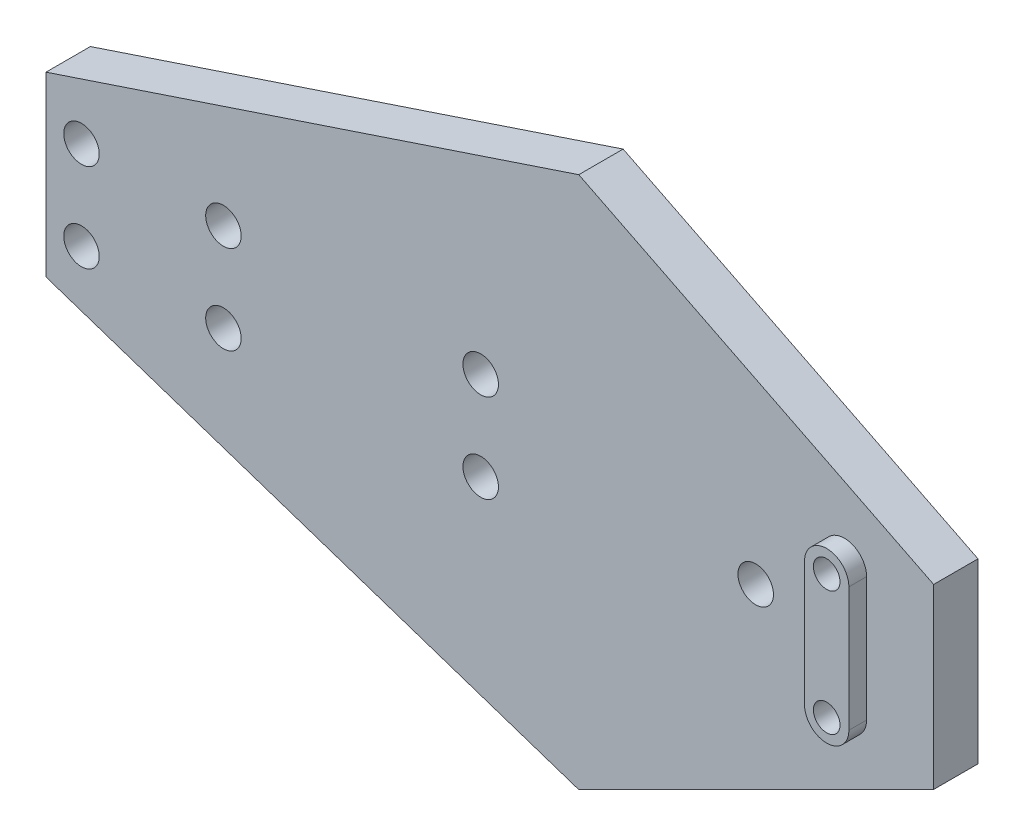
ISO-10303-21;
HEADER;
FILE_DESCRIPTION(('STEP AP214'),'2;1');
FILE_NAME('part.step','',(''),(''),'','','');
FILE_SCHEMA(('AUTOMOTIVE_DESIGN { 1 0 10303 214 1 1 1 1 }'));
ENDSEC;
DATA;
#1=APPLICATION_CONTEXT('core data for automotive mechanical design processes');
#2=APPLICATION_PROTOCOL_DEFINITION('international standard','automotive_design',2000,#1);
#3=PRODUCT_CONTEXT('',#1,'mechanical');
#4=PRODUCT('Part','Part','',(#3));
#5=PRODUCT_RELATED_PRODUCT_CATEGORY('part','',(#4));
#6=PRODUCT_DEFINITION_FORMATION('','',#4);
#7=PRODUCT_DEFINITION_CONTEXT('part definition',#1,'design');
#8=PRODUCT_DEFINITION('design','',#6,#7);
#9=PRODUCT_DEFINITION_SHAPE('','',#8);
#10=(LENGTH_UNIT() NAMED_UNIT(*) SI_UNIT(.MILLI.,.METRE.));
#11=(NAMED_UNIT(*) PLANE_ANGLE_UNIT() SI_UNIT($,.RADIAN.));
#12=(NAMED_UNIT(*) SI_UNIT($,.STERADIAN.) SOLID_ANGLE_UNIT());
#13=UNCERTAINTY_MEASURE_WITH_UNIT(LENGTH_MEASURE(1.E-05),#10,'distance_accuracy_value','');
#14=(GEOMETRIC_REPRESENTATION_CONTEXT(3) GLOBAL_UNCERTAINTY_ASSIGNED_CONTEXT((#13)) GLOBAL_UNIT_ASSIGNED_CONTEXT((#10,
#11,#12)) REPRESENTATION_CONTEXT('',''));
#15=CARTESIAN_POINT('',(0.,0.,0.));
#16=DIRECTION('',(0.,0.,1.));
#17=DIRECTION('',(1.,0.,0.));
#18=AXIS2_PLACEMENT_3D('',#15,#16,#17);
#19=CARTESIAN_POINT('',(0.,0.,2.5));
#20=DIRECTION('',(0.,0.,1.));
#21=DIRECTION('',(1.,0.,0.));
#22=AXIS2_PLACEMENT_3D('',#19,#20,#21);
#23=PLANE('',#22);
#24=CARTESIAN_POINT('',(49.,15.,2.5));
#25=DIRECTION('',(0.,0.,1.));
#26=DIRECTION('',(1.,0.,0.));
#27=AXIS2_PLACEMENT_3D('',#24,#25,#26);
#28=CIRCLE('',#27,2.);
#29=CARTESIAN_POINT('',(51.,15.,2.5));
#30=VERTEX_POINT('',#29);
#31=EDGE_CURVE('E204',#30,#30,#28,.T.);
#32=ORIENTED_EDGE('',*,*,#31,.F.);
#33=EDGE_LOOP('',(#32));
#34=FACE_BOUND('',#33,.T.);
#35=CARTESIAN_POINT('',(20.,15.,2.5));
#36=DIRECTION('',(0.,0.,1.));
#37=DIRECTION('',(1.,0.,0.));
#38=AXIS2_PLACEMENT_3D('',#35,#36,#37);
#39=CIRCLE('',#38,2.);
#40=CARTESIAN_POINT('',(22.,15.,2.5));
#41=VERTEX_POINT('',#40);
#42=EDGE_CURVE('E188',#41,#41,#39,.T.);
#43=ORIENTED_EDGE('',*,*,#42,.F.);
#44=EDGE_LOOP('',(#43));
#45=FACE_BOUND('',#44,.T.);
#46=DIRECTION('',(0.,-1.,0.));
#47=VECTOR('',#46,1.);
#48=CARTESIAN_POINT('',(0.,19.9970276153552,2.5));
#49=LINE('',#48,#47);
#50=CARTESIAN_POINT('',(0.,19.9970276153552,2.5));
#51=VERTEX_POINT('',#50);
#52=CARTESIAN_POINT('',(0.,0.,2.5));
#53=VERTEX_POINT('',#52);
#54=EDGE_CURVE('E159',#51,#53,#49,.T.);
#55=ORIENTED_EDGE('',*,*,#54,.T.);
#56=DIRECTION('',(0.948683298050514,-0.316227766016838,0.));
#57=VECTOR('',#56,1.);
#58=CARTESIAN_POINT('',(0.,0.,2.5));
#59=LINE('',#58,#57);
#60=CARTESIAN_POINT('',(60.0337040391287,-20.0112346797096,2.5));
#61=VERTEX_POINT('',#60);
#62=EDGE_CURVE('E99',#53,#61,#59,.T.);
#63=ORIENTED_EDGE('',*,*,#62,.T.);
#64=DIRECTION('',(0.894427190999916,0.447213595499958,0.));
#65=VECTOR('',#64,1.);
#66=CARTESIAN_POINT('',(60.0337040391287,-20.0112346797096,2.5));
#67=LINE('',#66,#65);
#68=CARTESIAN_POINT('',(100.056173398548,0.,2.5));
#69=VERTEX_POINT('',#68);
#70=EDGE_CURVE('E116',#61,#69,#67,.T.);
#71=ORIENTED_EDGE('',*,*,#70,.T.);
#72=DIRECTION('',(0.,1.,0.));
#73=VECTOR('',#72,1.);
#74=CARTESIAN_POINT('',(100.056173398548,0.,2.5));
#75=LINE('',#74,#73);
#76=CARTESIAN_POINT('',(100.056173398548,20.0157520815378,2.5));
#77=VERTEX_POINT('',#76);
#78=EDGE_CURVE('E109',#69,#77,#75,.T.);
#79=ORIENTED_EDGE('',*,*,#78,.T.);
#80=DIRECTION('',(-0.894427190999916,0.447213595499958,0.));
#81=VECTOR('',#80,1.);
#82=CARTESIAN_POINT('',(100.056173398548,20.0157520815378,2.5));
#83=LINE('',#82,#81);
#84=CARTESIAN_POINT('',(60.0561733985478,40.0157520815378,2.5));
#85=VERTEX_POINT('',#84);
#86=EDGE_CURVE('E113',#77,#85,#83,.T.);
#87=ORIENTED_EDGE('',*,*,#86,.T.);
#88=DIRECTION('',(-0.948683298050514,-0.316227766016838,0.));
#89=VECTOR('',#88,1.);
#90=CARTESIAN_POINT('',(60.0561733985478,40.0157520815378,2.5));
#91=LINE('',#90,#89);
#92=EDGE_CURVE('E64',#85,#51,#91,.T.);
#93=ORIENTED_EDGE('',*,*,#92,.T.);
#94=EDGE_LOOP('',(#55,#63,#71,#79,#87,#93));
#95=FACE_BOUND('',#94,.T.);
#96=CARTESIAN_POINT('',(20.,5.,2.5));
#97=DIRECTION('',(0.,0.,1.));
#98=DIRECTION('',(1.,0.,0.));
#99=AXIS2_PLACEMENT_3D('',#96,#97,#98);
#100=CIRCLE('',#99,2.);
#101=CARTESIAN_POINT('',(22.,5.,2.5));
#102=VERTEX_POINT('',#101);
#103=EDGE_CURVE('E146',#102,#102,#100,.T.);
#104=ORIENTED_EDGE('',*,*,#103,.F.);
#105=EDGE_LOOP('',(#104));
#106=FACE_BOUND('',#105,.T.);
#107=CARTESIAN_POINT('',(49.,5.,2.5));
#108=DIRECTION('',(0.,0.,1.));
#109=DIRECTION('',(1.,0.,0.));
#110=AXIS2_PLACEMENT_3D('',#107,#108,#109);
#111=CIRCLE('',#110,2.);
#112=CARTESIAN_POINT('',(51.,5.,2.5));
#113=VERTEX_POINT('',#112);
#114=EDGE_CURVE('E196',#113,#113,#111,.T.);
#115=ORIENTED_EDGE('',*,*,#114,.F.);
#116=EDGE_LOOP('',(#115));
#117=FACE_BOUND('',#116,.T.);
#118=CARTESIAN_POINT('',(4.,15.,2.5));
#119=DIRECTION('',(0.,0.,1.));
#120=DIRECTION('',(1.,0.,0.));
#121=AXIS2_PLACEMENT_3D('',#118,#119,#120);
#122=CIRCLE('',#121,2.);
#123=CARTESIAN_POINT('',(6.,15.,2.5));
#124=VERTEX_POINT('',#123);
#125=EDGE_CURVE('E224',#124,#124,#122,.T.);
#126=ORIENTED_EDGE('',*,*,#125,.F.);
#127=EDGE_LOOP('',(#126));
#128=FACE_BOUND('',#127,.T.);
#129=CARTESIAN_POINT('',(4.,5.,2.5));
#130=DIRECTION('',(0.,0.,1.));
#131=DIRECTION('',(1.,0.,0.));
#132=AXIS2_PLACEMENT_3D('',#129,#130,#131);
#133=CIRCLE('',#132,2.);
#134=CARTESIAN_POINT('',(6.,5.,2.5));
#135=VERTEX_POINT('',#134);
#136=EDGE_CURVE('E233',#135,#135,#133,.T.);
#137=ORIENTED_EDGE('',*,*,#136,.F.);
#138=EDGE_LOOP('',(#137));
#139=FACE_BOUND('',#138,.T.);
#140=CARTESIAN_POINT('',(80.,10.,2.5));
#141=DIRECTION('',(0.,0.,1.));
#142=DIRECTION('',(1.,0.,0.));
#143=AXIS2_PLACEMENT_3D('',#140,#141,#142);
#144=CIRCLE('',#143,2.);
#145=CARTESIAN_POINT('',(82.,10.,2.5));
#146=VERTEX_POINT('',#145);
#147=EDGE_CURVE('E241',#146,#146,#144,.T.);
#148=ORIENTED_EDGE('',*,*,#147,.F.);
#149=EDGE_LOOP('',(#148));
#150=FACE_BOUND('',#149,.T.);
#151=DIRECTION('',(0.,-1.,0.));
#152=VECTOR('',#151,1.);
#153=CARTESIAN_POINT('',(87.5,17.,2.5));
#154=LINE('',#153,#152);
#155=CARTESIAN_POINT('',(87.5,17.,2.5));
#156=VERTEX_POINT('',#155);
#157=CARTESIAN_POINT('',(87.5,3.,2.5));
#158=VERTEX_POINT('',#157);
#159=EDGE_CURVE('E269',#156,#158,#154,.T.);
#160=ORIENTED_EDGE('',*,*,#159,.F.);
#161=CARTESIAN_POINT('',(90.,17.,2.5));
#162=DIRECTION('',(0.,0.,1.));
#163=DIRECTION('',(1.,0.,0.));
#164=AXIS2_PLACEMENT_3D('',#161,#162,#163);
#165=CIRCLE('',#164,2.5);
#166=CARTESIAN_POINT('',(92.5,17.,2.5));
#167=VERTEX_POINT('',#166);
#168=EDGE_CURVE('E273',#167,#156,#165,.T.);
#169=ORIENTED_EDGE('',*,*,#168,.F.);
#170=DIRECTION('',(0.,1.,0.));
#171=VECTOR('',#170,1.);
#172=CARTESIAN_POINT('',(92.5,17.,2.5));
#173=LINE('',#172,#171);
#174=CARTESIAN_POINT('',(92.5,3.,2.5));
#175=VERTEX_POINT('',#174);
#176=EDGE_CURVE('E262',#175,#167,#173,.T.);
#177=ORIENTED_EDGE('',*,*,#176,.F.);
#178=CARTESIAN_POINT('',(90.,3.,2.5));
#179=DIRECTION('',(0.,0.,1.));
#180=DIRECTION('',(1.,0.,0.));
#181=AXIS2_PLACEMENT_3D('',#178,#179,#180);
#182=CIRCLE('',#181,2.5);
#183=EDGE_CURVE('E266',#158,#175,#182,.T.);
#184=ORIENTED_EDGE('',*,*,#183,.F.);
#185=EDGE_LOOP('',(#160,#169,#177,#184));
#186=FACE_BOUND('',#185,.T.);
#187=ADVANCED_FACE('F39',(#34,#45,#95,#106,#117,#128,#139,#150,#186),#23,.T.);
#188=CARTESIAN_POINT('',(0.,0.,-2.5));
#189=DIRECTION('',(0.,0.,1.));
#190=DIRECTION('',(1.,0.,0.));
#191=AXIS2_PLACEMENT_3D('',#188,#189,#190);
#192=PLANE('',#191);
#193=CARTESIAN_POINT('',(80.,10.,-2.5));
#194=DIRECTION('',(0.,0.,1.));
#195=DIRECTION('',(1.,0.,0.));
#196=AXIS2_PLACEMENT_3D('',#193,#194,#195);
#197=CIRCLE('',#196,2.);
#198=CARTESIAN_POINT('',(82.,10.,-2.5));
#199=VERTEX_POINT('',#198);
#200=EDGE_CURVE('E223',#199,#199,#197,.T.);
#201=ORIENTED_EDGE('',*,*,#200,.T.);
#202=EDGE_LOOP('',(#201));
#203=FACE_BOUND('',#202,.T.);
#204=CARTESIAN_POINT('',(4.,5.,-2.5));
#205=DIRECTION('',(0.,0.,1.));
#206=DIRECTION('',(1.,0.,0.));
#207=AXIS2_PLACEMENT_3D('',#204,#205,#206);
#208=CIRCLE('',#207,2.);
#209=CARTESIAN_POINT('',(6.,5.,-2.5));
#210=VERTEX_POINT('',#209);
#211=EDGE_CURVE('E237',#210,#210,#208,.T.);
#212=ORIENTED_EDGE('',*,*,#211,.T.);
#213=EDGE_LOOP('',(#212));
#214=FACE_BOUND('',#213,.T.);
#215=CARTESIAN_POINT('',(4.,15.,-2.5));
#216=DIRECTION('',(0.,0.,1.));
#217=DIRECTION('',(1.,0.,0.));
#218=AXIS2_PLACEMENT_3D('',#215,#216,#217);
#219=CIRCLE('',#218,2.);
#220=CARTESIAN_POINT('',(6.,15.,-2.5));
#221=VERTEX_POINT('',#220);
#222=EDGE_CURVE('E228',#221,#221,#219,.T.);
#223=ORIENTED_EDGE('',*,*,#222,.T.);
#224=EDGE_LOOP('',(#223));
#225=FACE_BOUND('',#224,.T.);
#226=DIRECTION('',(0.,-1.,0.));
#227=VECTOR('',#226,1.);
#228=CARTESIAN_POINT('',(0.,19.9970276153552,-2.5));
#229=LINE('',#228,#227);
#230=CARTESIAN_POINT('',(0.,19.9970276153552,-2.5));
#231=VERTEX_POINT('',#230);
#232=CARTESIAN_POINT('',(0.,0.,-2.5));
#233=VERTEX_POINT('',#232);
#234=EDGE_CURVE('E141',#231,#233,#229,.T.);
#235=ORIENTED_EDGE('',*,*,#234,.F.);
#236=DIRECTION('',(-0.948683298050514,-0.316227766016838,0.));
#237=VECTOR('',#236,1.);
#238=CARTESIAN_POINT('',(60.0561733985478,40.0157520815378,-2.5));
#239=LINE('',#238,#237);
#240=CARTESIAN_POINT('',(60.0561733985478,40.0157520815378,-2.5));
#241=VERTEX_POINT('',#240);
#242=EDGE_CURVE('E91',#241,#231,#239,.T.);
#243=ORIENTED_EDGE('',*,*,#242,.F.);
#244=DIRECTION('',(-0.894427190999916,0.447213595499958,0.));
#245=VECTOR('',#244,1.);
#246=CARTESIAN_POINT('',(100.056173398548,20.0157520815378,-2.5));
#247=LINE('',#246,#245);
#248=CARTESIAN_POINT('',(100.056173398548,20.0157520815378,-2.5));
#249=VERTEX_POINT('',#248);
#250=EDGE_CURVE('E154',#249,#241,#247,.T.);
#251=ORIENTED_EDGE('',*,*,#250,.F.);
#252=DIRECTION('',(0.,1.,0.));
#253=VECTOR('',#252,1.);
#254=CARTESIAN_POINT('',(100.056173398548,0.,-2.5));
#255=LINE('',#254,#253);
#256=CARTESIAN_POINT('',(100.056173398548,0.,-2.5));
#257=VERTEX_POINT('',#256);
#258=EDGE_CURVE('E126',#257,#249,#255,.T.);
#259=ORIENTED_EDGE('',*,*,#258,.F.);
#260=DIRECTION('',(0.894427190999916,0.447213595499958,0.));
#261=VECTOR('',#260,1.);
#262=CARTESIAN_POINT('',(60.0337040391287,-20.0112346797096,-2.5));
#263=LINE('',#262,#261);
#264=CARTESIAN_POINT('',(60.0337040391287,-20.0112346797096,-2.5));
#265=VERTEX_POINT('',#264);
#266=EDGE_CURVE('E149',#265,#257,#263,.T.);
#267=ORIENTED_EDGE('',*,*,#266,.F.);
#268=DIRECTION('',(0.948683298050514,-0.316227766016838,0.));
#269=VECTOR('',#268,1.);
#270=CARTESIAN_POINT('',(0.,0.,-2.5));
#271=LINE('',#270,#269);
#272=EDGE_CURVE('E145',#233,#265,#271,.T.);
#273=ORIENTED_EDGE('',*,*,#272,.F.);
#274=EDGE_LOOP('',(#235,#243,#251,#259,#267,#273));
#275=FACE_BOUND('',#274,.T.);
#276=CARTESIAN_POINT('',(20.,5.,-2.5));
#277=DIRECTION('',(0.,0.,1.));
#278=DIRECTION('',(1.,0.,0.));
#279=AXIS2_PLACEMENT_3D('',#276,#277,#278);
#280=CIRCLE('',#279,2.);
#281=CARTESIAN_POINT('',(22.,5.,-2.5));
#282=VERTEX_POINT('',#281);
#283=EDGE_CURVE('E183',#282,#282,#280,.T.);
#284=ORIENTED_EDGE('',*,*,#283,.T.);
#285=EDGE_LOOP('',(#284));
#286=FACE_BOUND('',#285,.T.);
#287=CARTESIAN_POINT('',(20.,15.,-2.5));
#288=DIRECTION('',(0.,0.,1.));
#289=DIRECTION('',(1.,0.,0.));
#290=AXIS2_PLACEMENT_3D('',#287,#288,#289);
#291=CIRCLE('',#290,2.);
#292=CARTESIAN_POINT('',(22.,15.,-2.5));
#293=VERTEX_POINT('',#292);
#294=EDGE_CURVE('E192',#293,#293,#291,.T.);
#295=ORIENTED_EDGE('',*,*,#294,.T.);
#296=EDGE_LOOP('',(#295));
#297=FACE_BOUND('',#296,.T.);
#298=CARTESIAN_POINT('',(49.,5.,-2.5));
#299=DIRECTION('',(0.,0.,1.));
#300=DIRECTION('',(1.,0.,0.));
#301=AXIS2_PLACEMENT_3D('',#298,#299,#300);
#302=CIRCLE('',#301,2.);
#303=CARTESIAN_POINT('',(51.,5.,-2.5));
#304=VERTEX_POINT('',#303);
#305=EDGE_CURVE('E200',#304,#304,#302,.T.);
#306=ORIENTED_EDGE('',*,*,#305,.T.);
#307=EDGE_LOOP('',(#306));
#308=FACE_BOUND('',#307,.T.);
#309=CARTESIAN_POINT('',(49.,15.,-2.5));
#310=DIRECTION('',(0.,0.,1.));
#311=DIRECTION('',(1.,0.,0.));
#312=AXIS2_PLACEMENT_3D('',#309,#310,#311);
#313=CIRCLE('',#312,2.);
#314=CARTESIAN_POINT('',(51.,15.,-2.5));
#315=VERTEX_POINT('',#314);
#316=EDGE_CURVE('E208',#315,#315,#313,.T.);
#317=ORIENTED_EDGE('',*,*,#316,.T.);
#318=EDGE_LOOP('',(#317));
#319=FACE_BOUND('',#318,.T.);
#320=CARTESIAN_POINT('',(90.,17.,-2.5));
#321=DIRECTION('',(0.,0.,1.));
#322=DIRECTION('',(1.,0.,0.));
#323=AXIS2_PLACEMENT_3D('',#320,#321,#322);
#324=CIRCLE('',#323,1.5);
#325=CARTESIAN_POINT('',(91.5,17.,-2.5));
#326=VERTEX_POINT('',#325);
#327=EDGE_CURVE('E212',#326,#326,#324,.T.);
#328=ORIENTED_EDGE('',*,*,#327,.T.);
#329=EDGE_LOOP('',(#328));
#330=FACE_BOUND('',#329,.T.);
#331=CARTESIAN_POINT('',(90.,3.,-2.5));
#332=DIRECTION('',(0.,0.,1.));
#333=DIRECTION('',(1.,0.,0.));
#334=AXIS2_PLACEMENT_3D('',#331,#332,#333);
#335=CIRCLE('',#334,1.5);
#336=CARTESIAN_POINT('',(91.5,3.,-2.5));
#337=VERTEX_POINT('',#336);
#338=EDGE_CURVE('E219',#337,#337,#335,.T.);
#339=ORIENTED_EDGE('',*,*,#338,.T.);
#340=EDGE_LOOP('',(#339));
#341=FACE_BOUND('',#340,.T.);
#342=ADVANCED_FACE('F172',(#203,#214,#225,#275,#286,#297,#308,#319,#330,#341),#192,.F.);
#343=CARTESIAN_POINT('',(0.,19.9970276153552,2.5));
#344=DIRECTION('',(1.,0.,0.));
#345=DIRECTION('',(0.,0.,-1.));
#346=AXIS2_PLACEMENT_3D('',#343,#344,#345);
#347=PLANE('',#346);
#348=ORIENTED_EDGE('',*,*,#234,.T.);
#349=DIRECTION('',(0.,0.,-1.));
#350=VECTOR('',#349,1.);
#351=CARTESIAN_POINT('',(0.,0.,2.5));
#352=LINE('',#351,#350);
#353=EDGE_CURVE('E11',#53,#233,#352,.T.);
#354=ORIENTED_EDGE('',*,*,#353,.F.);
#355=ORIENTED_EDGE('',*,*,#54,.F.);
#356=DIRECTION('',(0.,0.,-1.));
#357=VECTOR('',#356,1.);
#358=CARTESIAN_POINT('',(0.,19.9970276153552,2.5));
#359=LINE('',#358,#357);
#360=EDGE_CURVE('E137',#51,#231,#359,.T.);
#361=ORIENTED_EDGE('',*,*,#360,.T.);
#362=EDGE_LOOP('',(#348,#354,#355,#361));
#363=FACE_BOUND('',#362,.T.);
#364=ADVANCED_FACE('F41',(#363),#347,.F.);
#365=CARTESIAN_POINT('',(0.,0.,2.5));
#366=DIRECTION('',(0.316227766016838,0.948683298050514,0.));
#367=DIRECTION('',(-0.948683298050514,0.316227766016838,0.));
#368=AXIS2_PLACEMENT_3D('',#365,#366,#367);
#369=PLANE('',#368);
#370=ORIENTED_EDGE('',*,*,#272,.T.);
#371=DIRECTION('',(0.,0.,-1.));
#372=VECTOR('',#371,1.);
#373=CARTESIAN_POINT('',(60.0337040391287,-20.0112346797096,2.5));
#374=LINE('',#373,#372);
#375=EDGE_CURVE('E48',#61,#265,#374,.T.);
#376=ORIENTED_EDGE('',*,*,#375,.F.);
#377=ORIENTED_EDGE('',*,*,#62,.F.);
#378=ORIENTED_EDGE('',*,*,#353,.T.);
#379=EDGE_LOOP('',(#370,#376,#377,#378));
#380=FACE_BOUND('',#379,.T.);
#381=ADVANCED_FACE('F342',(#380),#369,.F.);
#382=CARTESIAN_POINT('',(60.0337040391287,-20.0112346797096,2.5));
#383=DIRECTION('',(-0.447213595499958,0.894427190999916,0.));
#384=DIRECTION('',(-0.894427190999916,-0.447213595499958,0.));
#385=AXIS2_PLACEMENT_3D('',#382,#383,#384);
#386=PLANE('',#385);
#387=ORIENTED_EDGE('',*,*,#266,.T.);
#388=DIRECTION('',(0.,0.,-1.));
#389=VECTOR('',#388,1.);
#390=CARTESIAN_POINT('',(100.056173398548,0.,2.5));
#391=LINE('',#390,#389);
#392=EDGE_CURVE('E130',#69,#257,#391,.T.);
#393=ORIENTED_EDGE('',*,*,#392,.F.);
#394=ORIENTED_EDGE('',*,*,#70,.F.);
#395=ORIENTED_EDGE('',*,*,#375,.T.);
#396=EDGE_LOOP('',(#387,#393,#394,#395));
#397=FACE_BOUND('',#396,.T.);
#398=ADVANCED_FACE('F169',(#397),#386,.F.);
#399=CARTESIAN_POINT('',(100.056173398548,0.,2.5));
#400=DIRECTION('',(-1.,0.,0.));
#401=DIRECTION('',(0.,0.,1.));
#402=AXIS2_PLACEMENT_3D('',#399,#400,#401);
#403=PLANE('',#402);
#404=ORIENTED_EDGE('',*,*,#258,.T.);
#405=DIRECTION('',(0.,0.,-1.));
#406=VECTOR('',#405,1.);
#407=CARTESIAN_POINT('',(100.056173398548,20.0157520815378,2.5));
#408=LINE('',#407,#406);
#409=EDGE_CURVE('E123',#77,#249,#408,.T.);
#410=ORIENTED_EDGE('',*,*,#409,.F.);
#411=ORIENTED_EDGE('',*,*,#78,.F.);
#412=ORIENTED_EDGE('',*,*,#392,.T.);
#413=EDGE_LOOP('',(#404,#410,#411,#412));
#414=FACE_BOUND('',#413,.T.);
#415=ADVANCED_FACE('F124',(#414),#403,.F.);
#416=CARTESIAN_POINT('',(100.056173398548,20.0157520815378,2.5));
#417=DIRECTION('',(-0.447213595499958,-0.894427190999916,0.));
#418=DIRECTION('',(0.894427190999916,-0.447213595499958,0.));
#419=AXIS2_PLACEMENT_3D('',#416,#417,#418);
#420=PLANE('',#419);
#421=ORIENTED_EDGE('',*,*,#250,.T.);
#422=DIRECTION('',(0.,0.,-1.));
#423=VECTOR('',#422,1.);
#424=CARTESIAN_POINT('',(60.0561733985478,40.0157520815378,2.5));
#425=LINE('',#424,#423);
#426=EDGE_CURVE('E131',#85,#241,#425,.T.);
#427=ORIENTED_EDGE('',*,*,#426,.F.);
#428=ORIENTED_EDGE('',*,*,#86,.F.);
#429=ORIENTED_EDGE('',*,*,#409,.T.);
#430=EDGE_LOOP('',(#421,#427,#428,#429));
#431=FACE_BOUND('',#430,.T.);
#432=ADVANCED_FACE('F133',(#431),#420,.F.);
#433=CARTESIAN_POINT('',(60.0561733985478,40.0157520815378,2.5));
#434=DIRECTION('',(0.316227766016838,-0.948683298050514,0.));
#435=DIRECTION('',(0.948683298050514,0.316227766016838,0.));
#436=AXIS2_PLACEMENT_3D('',#433,#434,#435);
#437=PLANE('',#436);
#438=ORIENTED_EDGE('',*,*,#242,.T.);
#439=ORIENTED_EDGE('',*,*,#360,.F.);
#440=ORIENTED_EDGE('',*,*,#92,.F.);
#441=ORIENTED_EDGE('',*,*,#426,.T.);
#442=EDGE_LOOP('',(#438,#439,#440,#441));
#443=FACE_BOUND('',#442,.T.);
#444=ADVANCED_FACE('F174',(#443),#437,.F.);
#445=CARTESIAN_POINT('',(20.,5.,2.5));
#446=DIRECTION('',(0.,0.,-1.));
#447=DIRECTION('',(-1.,0.,0.));
#448=AXIS2_PLACEMENT_3D('',#445,#446,#447);
#449=CYLINDRICAL_SURFACE('',#448,2.);
#450=ORIENTED_EDGE('',*,*,#103,.T.);
#451=EDGE_LOOP('',(#450));
#452=FACE_BOUND('',#451,.T.);
#453=ORIENTED_EDGE('',*,*,#283,.F.);
#454=EDGE_LOOP('',(#453));
#455=FACE_BOUND('',#454,.T.);
#456=ADVANCED_FACE('F332',(#452,#455),#449,.F.);
#457=CARTESIAN_POINT('',(20.,15.,2.5));
#458=DIRECTION('',(0.,0.,-1.));
#459=DIRECTION('',(-1.,0.,0.));
#460=AXIS2_PLACEMENT_3D('',#457,#458,#459);
#461=CYLINDRICAL_SURFACE('',#460,2.);
#462=ORIENTED_EDGE('',*,*,#42,.T.);
#463=EDGE_LOOP('',(#462));
#464=FACE_BOUND('',#463,.T.);
#465=ORIENTED_EDGE('',*,*,#294,.F.);
#466=EDGE_LOOP('',(#465));
#467=FACE_BOUND('',#466,.T.);
#468=ADVANCED_FACE('F455',(#464,#467),#461,.F.);
#469=CARTESIAN_POINT('',(49.,5.,2.5));
#470=DIRECTION('',(0.,0.,-1.));
#471=DIRECTION('',(-1.,0.,0.));
#472=AXIS2_PLACEMENT_3D('',#469,#470,#471);
#473=CYLINDRICAL_SURFACE('',#472,2.);
#474=ORIENTED_EDGE('',*,*,#114,.T.);
#475=EDGE_LOOP('',(#474));
#476=FACE_BOUND('',#475,.T.);
#477=ORIENTED_EDGE('',*,*,#305,.F.);
#478=EDGE_LOOP('',(#477));
#479=FACE_BOUND('',#478,.T.);
#480=ADVANCED_FACE('F452',(#476,#479),#473,.F.);
#481=CARTESIAN_POINT('',(49.,15.,2.5));
#482=DIRECTION('',(0.,0.,-1.));
#483=DIRECTION('',(-1.,0.,0.));
#484=AXIS2_PLACEMENT_3D('',#481,#482,#483);
#485=CYLINDRICAL_SURFACE('',#484,2.);
#486=ORIENTED_EDGE('',*,*,#31,.T.);
#487=EDGE_LOOP('',(#486));
#488=FACE_BOUND('',#487,.T.);
#489=ORIENTED_EDGE('',*,*,#316,.F.);
#490=EDGE_LOOP('',(#489));
#491=FACE_BOUND('',#490,.T.);
#492=ADVANCED_FACE('F359',(#488,#491),#485,.F.);
#493=CARTESIAN_POINT('',(90.,17.,2.5));
#494=DIRECTION('',(0.,0.,-1.));
#495=DIRECTION('',(-1.,0.,0.));
#496=AXIS2_PLACEMENT_3D('',#493,#494,#495);
#497=CYLINDRICAL_SURFACE('',#496,1.5);
#498=ORIENTED_EDGE('',*,*,#327,.F.);
#499=EDGE_LOOP('',(#498));
#500=FACE_BOUND('',#499,.T.);
#501=CARTESIAN_POINT('',(90.,17.,4.5));
#502=DIRECTION('',(0.,0.,1.));
#503=DIRECTION('',(1.,0.,0.));
#504=AXIS2_PLACEMENT_3D('',#501,#502,#503);
#505=CIRCLE('',#504,1.5);
#506=CARTESIAN_POINT('',(91.5,17.,4.5));
#507=VERTEX_POINT('',#506);
#508=EDGE_CURVE('E277',#507,#507,#505,.T.);
#509=ORIENTED_EDGE('',*,*,#508,.T.);
#510=EDGE_LOOP('',(#509));
#511=FACE_BOUND('',#510,.T.);
#512=ADVANCED_FACE('F396',(#500,#511),#497,.F.);
#513=CARTESIAN_POINT('',(90.,3.,2.5));
#514=DIRECTION('',(0.,0.,-1.));
#515=DIRECTION('',(-1.,0.,0.));
#516=AXIS2_PLACEMENT_3D('',#513,#514,#515);
#517=CYLINDRICAL_SURFACE('',#516,1.5);
#518=ORIENTED_EDGE('',*,*,#338,.F.);
#519=EDGE_LOOP('',(#518));
#520=FACE_BOUND('',#519,.T.);
#521=CARTESIAN_POINT('',(90.,3.,4.5));
#522=DIRECTION('',(0.,0.,1.));
#523=DIRECTION('',(1.,0.,0.));
#524=AXIS2_PLACEMENT_3D('',#521,#522,#523);
#525=CIRCLE('',#524,1.5);
#526=CARTESIAN_POINT('',(91.5,3.,4.5));
#527=VERTEX_POINT('',#526);
#528=EDGE_CURVE('E295',#527,#527,#525,.T.);
#529=ORIENTED_EDGE('',*,*,#528,.T.);
#530=EDGE_LOOP('',(#529));
#531=FACE_BOUND('',#530,.T.);
#532=ADVANCED_FACE('F300',(#520,#531),#517,.F.);
#533=CARTESIAN_POINT('',(4.,15.,-2.5));
#534=DIRECTION('',(0.,0.,1.));
#535=DIRECTION('',(1.,0.,0.));
#536=AXIS2_PLACEMENT_3D('',#533,#534,#535);
#537=CYLINDRICAL_SURFACE('',#536,2.);
#538=ORIENTED_EDGE('',*,*,#222,.F.);
#539=EDGE_LOOP('',(#538));
#540=FACE_BOUND('',#539,.T.);
#541=ORIENTED_EDGE('',*,*,#125,.T.);
#542=EDGE_LOOP('',(#541));
#543=FACE_BOUND('',#542,.T.);
#544=ADVANCED_FACE('F364',(#540,#543),#537,.F.);
#545=CARTESIAN_POINT('',(4.,5.,-2.5));
#546=DIRECTION('',(0.,0.,1.));
#547=DIRECTION('',(1.,0.,0.));
#548=AXIS2_PLACEMENT_3D('',#545,#546,#547);
#549=CYLINDRICAL_SURFACE('',#548,2.);
#550=ORIENTED_EDGE('',*,*,#211,.F.);
#551=EDGE_LOOP('',(#550));
#552=FACE_BOUND('',#551,.T.);
#553=ORIENTED_EDGE('',*,*,#136,.T.);
#554=EDGE_LOOP('',(#553));
#555=FACE_BOUND('',#554,.T.);
#556=ADVANCED_FACE('F315',(#552,#555),#549,.F.);
#557=CARTESIAN_POINT('',(80.,10.,-2.5));
#558=DIRECTION('',(0.,0.,1.));
#559=DIRECTION('',(1.,0.,0.));
#560=AXIS2_PLACEMENT_3D('',#557,#558,#559);
#561=CYLINDRICAL_SURFACE('',#560,2.);
#562=ORIENTED_EDGE('',*,*,#200,.F.);
#563=EDGE_LOOP('',(#562));
#564=FACE_BOUND('',#563,.T.);
#565=ORIENTED_EDGE('',*,*,#147,.T.);
#566=EDGE_LOOP('',(#565));
#567=FACE_BOUND('',#566,.T.);
#568=ADVANCED_FACE('F305',(#564,#567),#561,.F.);
#569=CARTESIAN_POINT('',(90.,17.,4.5));
#570=DIRECTION('',(0.,0.,1.));
#571=DIRECTION('',(1.,0.,0.));
#572=AXIS2_PLACEMENT_3D('',#569,#570,#571);
#573=PLANE('',#572);
#574=ORIENTED_EDGE('',*,*,#508,.F.);
#575=EDGE_LOOP('',(#574));
#576=FACE_BOUND('',#575,.T.);
#577=CARTESIAN_POINT('',(90.,17.,4.5));
#578=DIRECTION('',(0.,0.,1.));
#579=DIRECTION('',(1.,0.,0.));
#580=AXIS2_PLACEMENT_3D('',#577,#578,#579);
#581=CIRCLE('',#580,2.5);
#582=CARTESIAN_POINT('',(92.5,17.,4.5));
#583=VERTEX_POINT('',#582);
#584=CARTESIAN_POINT('',(87.5,17.,4.5));
#585=VERTEX_POINT('',#584);
#586=EDGE_CURVE('E265',#583,#585,#581,.T.);
#587=ORIENTED_EDGE('',*,*,#586,.T.);
#588=DIRECTION('',(0.,-1.,0.));
#589=VECTOR('',#588,1.);
#590=CARTESIAN_POINT('',(87.5,17.,4.5));
#591=LINE('',#590,#589);
#592=CARTESIAN_POINT('',(87.5,3.,4.5));
#593=VERTEX_POINT('',#592);
#594=EDGE_CURVE('E285',#585,#593,#591,.T.);
#595=ORIENTED_EDGE('',*,*,#594,.T.);
#596=CARTESIAN_POINT('',(90.,3.,4.5));
#597=DIRECTION('',(0.,0.,1.));
#598=DIRECTION('',(1.,0.,0.));
#599=AXIS2_PLACEMENT_3D('',#596,#597,#598);
#600=CIRCLE('',#599,2.5);
#601=CARTESIAN_POINT('',(92.5,3.,4.5));
#602=VERTEX_POINT('',#601);
#603=EDGE_CURVE('E281',#593,#602,#600,.T.);
#604=ORIENTED_EDGE('',*,*,#603,.T.);
#605=DIRECTION('',(0.,1.,0.));
#606=VECTOR('',#605,1.);
#607=CARTESIAN_POINT('',(92.5,17.,4.5));
#608=LINE('',#607,#606);
#609=EDGE_CURVE('E261',#602,#583,#608,.T.);
#610=ORIENTED_EDGE('',*,*,#609,.T.);
#611=EDGE_LOOP('',(#587,#595,#604,#610));
#612=FACE_BOUND('',#611,.T.);
#613=ORIENTED_EDGE('',*,*,#528,.F.);
#614=EDGE_LOOP('',(#613));
#615=FACE_BOUND('',#614,.T.);
#616=ADVANCED_FACE('F302',(#576,#612,#615),#573,.T.);
#617=CARTESIAN_POINT('',(90.,17.,4.5));
#618=DIRECTION('',(0.,0.,-1.));
#619=DIRECTION('',(-1.,0.,0.));
#620=AXIS2_PLACEMENT_3D('',#617,#618,#619);
#621=CYLINDRICAL_SURFACE('',#620,2.5);
#622=ORIENTED_EDGE('',*,*,#168,.T.);
#623=DIRECTION('',(0.,0.,-1.));
#624=VECTOR('',#623,1.);
#625=CARTESIAN_POINT('',(87.5,17.,4.5));
#626=LINE('',#625,#624);
#627=EDGE_CURVE('E229',#585,#156,#626,.T.);
#628=ORIENTED_EDGE('',*,*,#627,.F.);
#629=ORIENTED_EDGE('',*,*,#586,.F.);
#630=DIRECTION('',(0.,0.,-1.));
#631=VECTOR('',#630,1.);
#632=CARTESIAN_POINT('',(92.5,17.,4.5));
#633=LINE('',#632,#631);
#634=EDGE_CURVE('E257',#583,#167,#633,.T.);
#635=ORIENTED_EDGE('',*,*,#634,.T.);
#636=EDGE_LOOP('',(#622,#628,#629,#635));
#637=FACE_BOUND('',#636,.T.);
#638=ADVANCED_FACE('F304',(#637),#621,.T.);
#639=CARTESIAN_POINT('',(87.5,17.,4.5));
#640=DIRECTION('',(1.,0.,0.));
#641=DIRECTION('',(0.,0.,-1.));
#642=AXIS2_PLACEMENT_3D('',#639,#640,#641);
#643=PLANE('',#642);
#644=ORIENTED_EDGE('',*,*,#159,.T.);
#645=DIRECTION('',(0.,0.,-1.));
#646=VECTOR('',#645,1.);
#647=CARTESIAN_POINT('',(87.5,3.,4.5));
#648=LINE('',#647,#646);
#649=EDGE_CURVE('E251',#593,#158,#648,.T.);
#650=ORIENTED_EDGE('',*,*,#649,.F.);
#651=ORIENTED_EDGE('',*,*,#594,.F.);
#652=ORIENTED_EDGE('',*,*,#627,.T.);
#653=EDGE_LOOP('',(#644,#650,#651,#652));
#654=FACE_BOUND('',#653,.T.);
#655=ADVANCED_FACE('F312',(#654),#643,.F.);
#656=CARTESIAN_POINT('',(90.,3.,4.5));
#657=DIRECTION('',(0.,0.,-1.));
#658=DIRECTION('',(-1.,0.,0.));
#659=AXIS2_PLACEMENT_3D('',#656,#657,#658);
#660=CYLINDRICAL_SURFACE('',#659,2.5);
#661=ORIENTED_EDGE('',*,*,#183,.T.);
#662=DIRECTION('',(0.,0.,-1.));
#663=VECTOR('',#662,1.);
#664=CARTESIAN_POINT('',(92.5,3.,4.5));
#665=LINE('',#664,#663);
#666=EDGE_CURVE('E55',#602,#175,#665,.T.);
#667=ORIENTED_EDGE('',*,*,#666,.F.);
#668=ORIENTED_EDGE('',*,*,#603,.F.);
#669=ORIENTED_EDGE('',*,*,#649,.T.);
#670=EDGE_LOOP('',(#661,#667,#668,#669));
#671=FACE_BOUND('',#670,.T.);
#672=ADVANCED_FACE('F428',(#671),#660,.T.);
#673=CARTESIAN_POINT('',(92.5,17.,4.5));
#674=DIRECTION('',(-1.,0.,0.));
#675=DIRECTION('',(0.,0.,1.));
#676=AXIS2_PLACEMENT_3D('',#673,#674,#675);
#677=PLANE('',#676);
#678=ORIENTED_EDGE('',*,*,#176,.T.);
#679=ORIENTED_EDGE('',*,*,#634,.F.);
#680=ORIENTED_EDGE('',*,*,#609,.F.);
#681=ORIENTED_EDGE('',*,*,#666,.T.);
#682=EDGE_LOOP('',(#678,#679,#680,#681));
#683=FACE_BOUND('',#682,.T.);
#684=ADVANCED_FACE('F438',(#683),#677,.F.);
#685=CLOSED_SHELL('',(#187,#342,#364,#381,#398,#415,#432,#444,#456,#468,#480,#492,#512,#532,
#544,#556,#568,#616,#638,#655,#672,#684));
#686=MANIFOLD_SOLID_BREP('B2',#685);
#687=ADVANCED_BREP_SHAPE_REPRESENTATION('',(#18,#686),#14);
#688=SHAPE_DEFINITION_REPRESENTATION(#9,#687);
ENDSEC;
END-ISO-10303-21;
